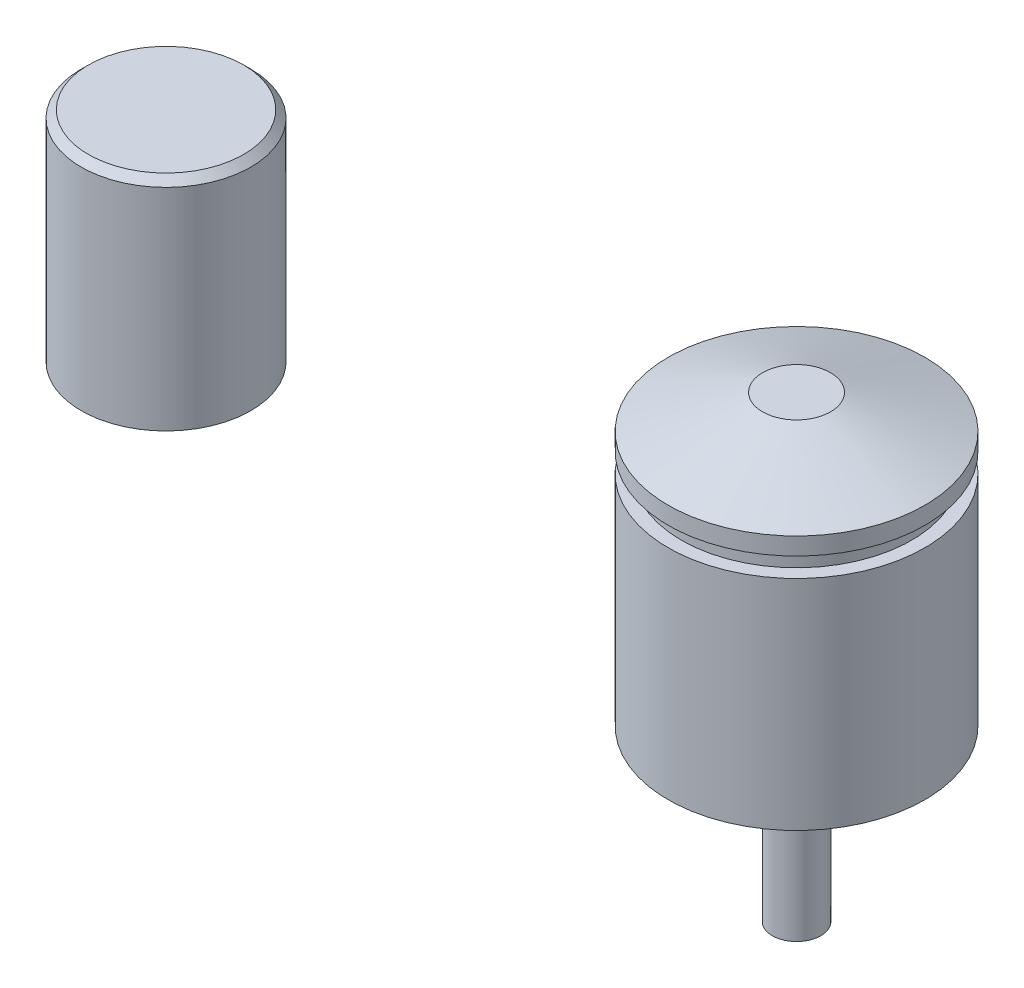
ISO-10303-21;
HEADER;
FILE_DESCRIPTION(('STEP AP214'),'2;1');
FILE_NAME('part.step','',(''),(''),'','','');
FILE_SCHEMA(('AUTOMOTIVE_DESIGN { 1 0 10303 214 1 1 1 1 }'));
ENDSEC;
DATA;
#1=APPLICATION_CONTEXT('core data for automotive mechanical design processes');
#2=APPLICATION_PROTOCOL_DEFINITION('international standard','automotive_design',2000,#1);
#3=PRODUCT_CONTEXT('',#1,'mechanical');
#4=PRODUCT('Part','Part','',(#3));
#5=PRODUCT_RELATED_PRODUCT_CATEGORY('part','',(#4));
#6=PRODUCT_DEFINITION_FORMATION('','',#4);
#7=PRODUCT_DEFINITION_CONTEXT('part definition',#1,'design');
#8=PRODUCT_DEFINITION('design','',#6,#7);
#9=PRODUCT_DEFINITION_SHAPE('','',#8);
#10=(LENGTH_UNIT() NAMED_UNIT(*) SI_UNIT(.MILLI.,.METRE.));
#11=(NAMED_UNIT(*) PLANE_ANGLE_UNIT() SI_UNIT($,.RADIAN.));
#12=(NAMED_UNIT(*) SI_UNIT($,.STERADIAN.) SOLID_ANGLE_UNIT());
#13=UNCERTAINTY_MEASURE_WITH_UNIT(LENGTH_MEASURE(1.E-05),#10,'distance_accuracy_value','');
#14=(GEOMETRIC_REPRESENTATION_CONTEXT(3) GLOBAL_UNCERTAINTY_ASSIGNED_CONTEXT((#13)) GLOBAL_UNIT_ASSIGNED_CONTEXT((#10,
#11,#12)) REPRESENTATION_CONTEXT('',''));
#15=CARTESIAN_POINT('',(0.,0.,0.));
#16=DIRECTION('',(0.,0.,1.));
#17=DIRECTION('',(1.,0.,0.));
#18=AXIS2_PLACEMENT_3D('',#15,#16,#17);
#19=CARTESIAN_POINT('',(13.,30.6,0.));
#20=DIRECTION('',(0.,1.,0.));
#21=DIRECTION('',(0.,0.,1.));
#22=AXIS2_PLACEMENT_3D('',#19,#20,#21);
#23=PLANE('',#22);
#24=CARTESIAN_POINT('',(13.,30.6,0.));
#25=DIRECTION('',(0.,-1.,0.));
#26=DIRECTION('',(0.,0.,-1.));
#27=AXIS2_PLACEMENT_3D('',#24,#25,#26);
#28=CIRCLE('',#27,0.499999999999999);
#29=CARTESIAN_POINT('',(13.,30.6,-0.499999999999999));
#30=VERTEX_POINT('',#29);
#31=EDGE_CURVE('E13',#30,#30,#28,.T.);
#32=ORIENTED_EDGE('',*,*,#31,.T.);
#33=EDGE_LOOP('',(#32));
#34=FACE_BOUND('',#33,.T.);
#35=ADVANCED_FACE('F56',(#34),#23,.F.);
#36=CARTESIAN_POINT('',(13.,34.1,0.));
#37=DIRECTION('',(0.,-1.,0.));
#38=DIRECTION('',(0.,0.,-1.));
#39=AXIS2_PLACEMENT_3D('',#36,#37,#38);
#40=CYLINDRICAL_SURFACE('',#39,0.499999999999999);
#41=ORIENTED_EDGE('',*,*,#31,.F.);
#42=EDGE_LOOP('',(#41));
#43=FACE_BOUND('',#42,.T.);
#44=CARTESIAN_POINT('',(13.,34.1,0.));
#45=DIRECTION('',(0.,-1.,0.));
#46=DIRECTION('',(0.,0.,-1.));
#47=AXIS2_PLACEMENT_3D('',#44,#45,#46);
#48=CIRCLE('',#47,0.499999999999999);
#49=CARTESIAN_POINT('',(13.,34.1,-0.499999999999999));
#50=VERTEX_POINT('',#49);
#51=EDGE_CURVE('E62',#50,#50,#48,.T.);
#52=ORIENTED_EDGE('',*,*,#51,.T.);
#53=EDGE_LOOP('',(#52));
#54=FACE_BOUND('',#53,.T.);
#55=ADVANCED_FACE('F103',(#43,#54),#40,.T.);
#56=CARTESIAN_POINT('',(12.5,34.1,0.));
#57=DIRECTION('',(0.,1.,0.));
#58=DIRECTION('',(0.,0.,1.));
#59=AXIS2_PLACEMENT_3D('',#56,#57,#58);
#60=PLANE('',#59);
#61=ORIENTED_EDGE('',*,*,#51,.F.);
#62=EDGE_LOOP('',(#61));
#63=FACE_BOUND('',#62,.T.);
#64=CARTESIAN_POINT('',(13.,34.1,0.));
#65=DIRECTION('',(0.,-1.,0.));
#66=DIRECTION('',(0.,0.,-1.));
#67=AXIS2_PLACEMENT_3D('',#64,#65,#66);
#68=CIRCLE('',#67,2.64559279724284);
#69=CARTESIAN_POINT('',(13.,34.1,-2.64559279724284));
#70=VERTEX_POINT('',#69);
#71=EDGE_CURVE('E66',#70,#70,#68,.T.);
#72=ORIENTED_EDGE('',*,*,#71,.T.);
#73=EDGE_LOOP('',(#72));
#74=FACE_BOUND('',#73,.T.);
#75=ADVANCED_FACE('F107',(#63,#74),#60,.F.);
#76=CARTESIAN_POINT('',(13.,34.1,0.));
#77=DIRECTION('',(0.,-1.,0.));
#78=DIRECTION('',(0.,0.,-1.));
#79=AXIS2_PLACEMENT_3D('',#76,#77,#78);
#80=CYLINDRICAL_SURFACE('',#79,2.64559279724284);
#81=ORIENTED_EDGE('',*,*,#71,.F.);
#82=EDGE_LOOP('',(#81));
#83=FACE_BOUND('',#82,.T.);
#84=CARTESIAN_POINT('',(13.,38.6,0.));
#85=DIRECTION('',(0.,-1.,0.));
#86=DIRECTION('',(0.,0.,-1.));
#87=AXIS2_PLACEMENT_3D('',#84,#85,#86);
#88=CIRCLE('',#87,2.64559279724284);
#89=CARTESIAN_POINT('',(13.,38.6,-2.64559279724284));
#90=VERTEX_POINT('',#89);
#91=EDGE_CURVE('E70',#90,#90,#88,.T.);
#92=ORIENTED_EDGE('',*,*,#91,.T.);
#93=EDGE_LOOP('',(#92));
#94=FACE_BOUND('',#93,.T.);
#95=ADVANCED_FACE('F112',(#83,#94),#80,.T.);
#96=CARTESIAN_POINT('',(10.3544072027572,38.6,0.));
#97=DIRECTION('',(0.,-1.,0.));
#98=DIRECTION('',(0.,0.,-1.));
#99=AXIS2_PLACEMENT_3D('',#96,#97,#98);
#100=PLANE('',#99);
#101=ORIENTED_EDGE('',*,*,#91,.F.);
#102=EDGE_LOOP('',(#101));
#103=FACE_BOUND('',#102,.T.);
#104=CARTESIAN_POINT('',(13.,38.6,0.));
#105=DIRECTION('',(0.,-1.,0.));
#106=DIRECTION('',(0.,0.,-1.));
#107=AXIS2_PLACEMENT_3D('',#104,#105,#106);
#108=CIRCLE('',#107,2.375);
#109=CARTESIAN_POINT('',(13.,38.6,-2.375));
#110=VERTEX_POINT('',#109);
#111=EDGE_CURVE('E75',#110,#110,#108,.T.);
#112=ORIENTED_EDGE('',*,*,#111,.T.);
#113=EDGE_LOOP('',(#112));
#114=FACE_BOUND('',#113,.T.);
#115=ADVANCED_FACE('F118',(#103,#114),#100,.F.);
#116=CARTESIAN_POINT('',(13.,34.1,0.));
#117=DIRECTION('',(0.,-1.,0.));
#118=DIRECTION('',(0.,0.,-1.));
#119=AXIS2_PLACEMENT_3D('',#116,#117,#118);
#120=CYLINDRICAL_SURFACE('',#119,2.375);
#121=ORIENTED_EDGE('',*,*,#111,.F.);
#122=EDGE_LOOP('',(#121));
#123=FACE_BOUND('',#122,.T.);
#124=CARTESIAN_POINT('',(13.,39.,0.));
#125=DIRECTION('',(0.,-1.,0.));
#126=DIRECTION('',(0.,0.,-1.));
#127=AXIS2_PLACEMENT_3D('',#124,#125,#126);
#128=CIRCLE('',#127,2.375);
#129=CARTESIAN_POINT('',(13.,39.,-2.375));
#130=VERTEX_POINT('',#129);
#131=EDGE_CURVE('E78',#130,#130,#128,.T.);
#132=ORIENTED_EDGE('',*,*,#131,.T.);
#133=EDGE_LOOP('',(#132));
#134=FACE_BOUND('',#133,.T.);
#135=ADVANCED_FACE('F122',(#123,#134),#120,.T.);
#136=CARTESIAN_POINT('',(10.625,39.,0.));
#137=DIRECTION('',(0.,1.,0.));
#138=DIRECTION('',(0.,0.,1.));
#139=AXIS2_PLACEMENT_3D('',#136,#137,#138);
#140=PLANE('',#139);
#141=ORIENTED_EDGE('',*,*,#131,.F.);
#142=EDGE_LOOP('',(#141));
#143=FACE_BOUND('',#142,.T.);
#144=CARTESIAN_POINT('',(13.,39.,0.));
#145=DIRECTION('',(0.,-1.,0.));
#146=DIRECTION('',(0.,0.,-1.));
#147=AXIS2_PLACEMENT_3D('',#144,#145,#146);
#148=CIRCLE('',#147,2.64559279724284);
#149=CARTESIAN_POINT('',(13.,39.,-2.64559279724284));
#150=VERTEX_POINT('',#149);
#151=EDGE_CURVE('E81',#150,#150,#148,.T.);
#152=ORIENTED_EDGE('',*,*,#151,.T.);
#153=EDGE_LOOP('',(#152));
#154=FACE_BOUND('',#153,.T.);
#155=ADVANCED_FACE('F126',(#143,#154),#140,.F.);
#156=CARTESIAN_POINT('',(13.,34.1,0.));
#157=DIRECTION('',(0.,-1.,0.));
#158=DIRECTION('',(0.,0.,-1.));
#159=AXIS2_PLACEMENT_3D('',#156,#157,#158);
#160=CYLINDRICAL_SURFACE('',#159,2.64559279724284);
#161=ORIENTED_EDGE('',*,*,#151,.F.);
#162=EDGE_LOOP('',(#161));
#163=FACE_BOUND('',#162,.T.);
#164=CARTESIAN_POINT('',(13.,39.3586912321662,0.));
#165=DIRECTION('',(0.,-1.,0.));
#166=DIRECTION('',(0.,0.,-1.));
#167=AXIS2_PLACEMENT_3D('',#164,#165,#166);
#168=CIRCLE('',#167,2.64559279724284);
#169=CARTESIAN_POINT('',(13.,39.3586912321662,-2.64559279724283));
#170=VERTEX_POINT('',#169);
#171=EDGE_CURVE('E84',#170,#170,#168,.T.);
#172=ORIENTED_EDGE('',*,*,#171,.T.);
#173=EDGE_LOOP('',(#172));
#174=FACE_BOUND('',#173,.T.);
#175=ADVANCED_FACE('F99',(#163,#174),#160,.T.);
#176=CARTESIAN_POINT('',(13.,40.0550943943815,0.));
#177=DIRECTION('',(0.,-1.,0.));
#178=DIRECTION('',(0.,0.,-1.));
#179=AXIS2_PLACEMENT_3D('',#176,#177,#178);
#180=CONICAL_SURFACE('',#179,0.699999999999999,1.22706665528975);
#181=CARTESIAN_POINT('',(13.,40.0550943943815,0.));
#182=DIRECTION('',(0.,-1.,0.));
#183=DIRECTION('',(0.,0.,-1.));
#184=AXIS2_PLACEMENT_3D('',#181,#182,#183);
#185=CIRCLE('',#184,0.699999999999999);
#186=CARTESIAN_POINT('',(13.,40.0550943943815,-0.69999999999999));
#187=VERTEX_POINT('',#186);
#188=EDGE_CURVE('E87',#187,#187,#185,.T.);
#189=CARTESIAN_POINT('',(13.,39.3586912321662,-2.64559279724283));
#190=CARTESIAN_POINT('',(13.,39.3659454317726,-2.62532620560488));
#191=CARTESIAN_POINT('',(13.,39.373199631379,-2.60505961396693));
#192=CARTESIAN_POINT('',(13.,39.3877080305918,-2.56452643069104));
#193=CARTESIAN_POINT('',(13.,39.3949622301983,-2.5442598390531));
#194=CARTESIAN_POINT('',(13.,39.4094706294111,-2.5037266557772));
#195=CARTESIAN_POINT('',(13.,39.4167248290175,-2.48346006413926));
#196=CARTESIAN_POINT('',(13.,39.4312332282303,-2.44292688086337));
#197=CARTESIAN_POINT('',(13.,39.4384874278367,-2.42266028922542));
#198=CARTESIAN_POINT('',(13.,39.4529958270495,-2.38212710594953));
#199=CARTESIAN_POINT('',(13.,39.4602500266559,-2.36186051431158));
#200=CARTESIAN_POINT('',(13.,39.4747584258688,-2.32132733103569));
#201=CARTESIAN_POINT('',(13.,39.4820126254752,-2.30106073939774));
#202=CARTESIAN_POINT('',(13.,39.496521024688,-2.26052755612185));
#203=CARTESIAN_POINT('',(13.,39.5037752242944,-2.2402609644839));
#204=CARTESIAN_POINT('',(13.,39.5182836235072,-2.19972778120801));
#205=CARTESIAN_POINT('',(13.,39.5255378231136,-2.17946118957006));
#206=CARTESIAN_POINT('',(13.,39.5400462223264,-2.13892800629417));
#207=CARTESIAN_POINT('',(13.,39.5473004219329,-2.11866141465623));
#208=CARTESIAN_POINT('',(13.,39.5618088211457,-2.07812823138033));
#209=CARTESIAN_POINT('',(13.,39.5690630207521,-2.05786163974239));
#210=CARTESIAN_POINT('',(13.,39.5835714199649,-2.01732845646649));
#211=CARTESIAN_POINT('',(13.,39.5908256195713,-1.99706186482855));
#212=CARTESIAN_POINT('',(13.,39.6053340187841,-1.95652868155266));
#213=CARTESIAN_POINT('',(13.,39.6125882183905,-1.93626208991471));
#214=CARTESIAN_POINT('',(13.,39.6270966176033,-1.89572890663882));
#215=CARTESIAN_POINT('',(13.,39.6343508172098,-1.87546231500087));
#216=CARTESIAN_POINT('',(13.,39.6488592164226,-1.83492913172498));
#217=CARTESIAN_POINT('',(13.,39.656113416029,-1.81466254008703));
#218=CARTESIAN_POINT('',(13.,39.6706218152418,-1.77412935681114));
#219=CARTESIAN_POINT('',(13.,39.6778760148482,-1.75386276517319));
#220=CARTESIAN_POINT('',(13.,39.692384414061,-1.7133295818973));
#221=CARTESIAN_POINT('',(13.,39.6996386136674,-1.69306299025936));
#222=CARTESIAN_POINT('',(13.,39.7141470128803,-1.65252980698346));
#223=CARTESIAN_POINT('',(13.,39.7214012124867,-1.63226321534552));
#224=CARTESIAN_POINT('',(13.,39.7359096116995,-1.59173003206962));
#225=CARTESIAN_POINT('',(13.,39.7431638113059,-1.57146344043168));
#226=CARTESIAN_POINT('',(13.,39.7576722105187,-1.53093025715579));
#227=CARTESIAN_POINT('',(13.,39.7649264101251,-1.51066366551784));
#228=CARTESIAN_POINT('',(13.,39.7794348093379,-1.47013048224195));
#229=CARTESIAN_POINT('',(13.,39.7866890089443,-1.449863890604));
#230=CARTESIAN_POINT('',(13.,39.8011974081572,-1.40933070732811));
#231=CARTESIAN_POINT('',(13.,39.8084516077636,-1.38906411569016));
#232=CARTESIAN_POINT('',(13.,39.8229600069764,-1.34853093241427));
#233=CARTESIAN_POINT('',(13.,39.8302142065828,-1.32826434077632));
#234=CARTESIAN_POINT('',(13.,39.8447226057956,-1.28773115750043));
#235=CARTESIAN_POINT('',(13.,39.851976805402,-1.26746456586248));
#236=CARTESIAN_POINT('',(13.,39.8664852046148,-1.22693138258659));
#237=CARTESIAN_POINT('',(13.,39.8737394042212,-1.20666479094865));
#238=CARTESIAN_POINT('',(13.,39.8882478034341,-1.16613160767275));
#239=CARTESIAN_POINT('',(13.,39.8955020030405,-1.14586501603481));
#240=CARTESIAN_POINT('',(13.,39.9100104022533,-1.10533183275891));
#241=CARTESIAN_POINT('',(13.,39.9172646018597,-1.08506524112097));
#242=CARTESIAN_POINT('',(13.,39.9317730010725,-1.04453205784508));
#243=CARTESIAN_POINT('',(13.,39.9390272006789,-1.02426546620713));
#244=CARTESIAN_POINT('',(13.,39.9535355998917,-0.983732282931237));
#245=CARTESIAN_POINT('',(13.,39.9607897994981,-0.96346569129329));
#246=CARTESIAN_POINT('',(13.,39.975298198711,-0.922932508017398));
#247=CARTESIAN_POINT('',(13.,39.9825523983174,-0.902665916379452));
#248=CARTESIAN_POINT('',(13.,39.9970607975302,-0.86213273310356));
#249=CARTESIAN_POINT('',(13.,40.0043149971366,-0.841866141465613));
#250=CARTESIAN_POINT('',(13.,40.0188233963494,-0.801332958189721));
#251=CARTESIAN_POINT('',(13.,40.0260775959558,-0.781066366551774));
#252=CARTESIAN_POINT('',(13.,40.0405859951686,-0.740533183275882));
#253=CARTESIAN_POINT('',(13.,40.0478401947751,-0.720266591637935));
#254=CARTESIAN_POINT('',(13.,40.0550943943815,-0.69999999999999));
#255=B_SPLINE_CURVE_WITH_KNOTS('',3,(#189,#190,#191,#192,#193,#194,#195,#196,#197,#198,#199,
#200,#201,#202,#203,#204,#205,#206,#207,#208,#209,#210,#211,#212,#213,#214,#215,#216,#217,#218,
#219,#220,#221,#222,#223,#224,#225,#226,#227,#228,#229,#230,#231,#232,#233,#234,#235,#236,#237,
#238,#239,#240,#241,#242,#243,#244,#245,#246,#247,#248,#249,#250,#251,#252,#253,#254),
.UNSPECIFIED.,.F.,.F.,(4,2,2,2,2,2,2,2,2,2,2,2,2,2,2,2,2,2,2,2,2,2,2,2,2,2,2,2,2,2,2,2,4),(0.,
0.0645772664096277,0.129154532819255,0.193731799228882,0.25830906563851,0.322886332048139,
0.387463598457766,0.452040864867394,0.516618131277023,0.581195397686651,0.645772664096278,
0.710349930505905,0.774927196915533,0.839504463325162,0.90408172973479,0.968658996144417,
1.03323626255405,1.09781352896367,1.1623907953733,1.22696806178293,1.29154532819256,
1.35612259460219,1.42069986101181,1.48527712742144,1.54985439383107,1.6144316602407,
1.67900892665032,1.74358619305995,1.80816345946958,1.87274072587921,1.93731799228884,
2.00189525869846,2.06647252510809),.UNSPECIFIED.);
#256=EDGE_CURVE('BSEAM91',#170,#187,#255,.T.);
#257=ORIENTED_EDGE('',*,*,#171,.F.);
#258=ORIENTED_EDGE('',*,*,#188,.T.);
#259=ORIENTED_EDGE('',*,*,#256,.T.);
#260=ORIENTED_EDGE('',*,*,#256,.F.);
#261=EDGE_LOOP('',(#257,#259,#258,#260));
#262=FACE_BOUND('',#261,.T.);
#263=ADVANCED_FACE('F91',(#262),#180,.T.);
#264=CARTESIAN_POINT('',(12.3,40.0550943943815,0.));
#265=DIRECTION('',(0.,-1.,0.));
#266=DIRECTION('',(0.,0.,-1.));
#267=AXIS2_PLACEMENT_3D('',#264,#265,#266);
#268=PLANE('',#267);
#269=ORIENTED_EDGE('',*,*,#188,.F.);
#270=EDGE_LOOP('',(#269));
#271=FACE_BOUND('',#270,.T.);
#272=ADVANCED_FACE('F93',(#271),#268,.F.);
#273=CLOSED_SHELL('',(#35,#55,#75,#95,#115,#135,#155,#175,#263,#272));
#274=MANIFOLD_SOLID_BREP('B2',#273);
#275=CARTESIAN_POINT('',(0.,37.3338765655707,0.));
#276=DIRECTION('',(0.,1.,0.));
#277=DIRECTION('',(0.,0.,1.));
#278=AXIS2_PLACEMENT_3D('',#275,#276,#277);
#279=PLANE('',#278);
#280=CARTESIAN_POINT('',(0.,37.3338765655707,0.));
#281=DIRECTION('',(0.,-1.,0.));
#282=DIRECTION('',(0.,0.,-1.));
#283=AXIS2_PLACEMENT_3D('',#280,#281,#282);
#284=CIRCLE('',#283,0.78167854951987);
#285=CARTESIAN_POINT('',(0.,37.3338765655707,-0.78167854951987));
#286=VERTEX_POINT('',#285);
#287=EDGE_CURVE('E218',#286,#286,#284,.T.);
#288=ORIENTED_EDGE('',*,*,#287,.T.);
#289=EDGE_LOOP('',(#288));
#290=FACE_BOUND('',#289,.T.);
#291=ADVANCED_FACE('F207',(#290),#279,.F.);
#292=CARTESIAN_POINT('',(0.,38.6,0.));
#293=DIRECTION('',(0.,-1.,0.));
#294=DIRECTION('',(0.,0.,-1.));
#295=AXIS2_PLACEMENT_3D('',#292,#293,#294);
#296=CYLINDRICAL_SURFACE('',#295,0.781678549519869);
#297=ORIENTED_EDGE('',*,*,#287,.F.);
#298=EDGE_LOOP('',(#297));
#299=FACE_BOUND('',#298,.T.);
#300=CARTESIAN_POINT('',(0.,34.1,0.));
#301=DIRECTION('',(0.,-1.,0.));
#302=DIRECTION('',(0.,0.,-1.));
#303=AXIS2_PLACEMENT_3D('',#300,#301,#302);
#304=CIRCLE('',#303,0.781678549519868);
#305=CARTESIAN_POINT('',(0.,34.1,-0.781678549519868));
#306=VERTEX_POINT('',#305);
#307=EDGE_CURVE('E222',#306,#306,#304,.T.);
#308=ORIENTED_EDGE('',*,*,#307,.T.);
#309=EDGE_LOOP('',(#308));
#310=FACE_BOUND('',#309,.T.);
#311=ADVANCED_FACE('F242',(#299,#310),#296,.F.);
#312=CARTESIAN_POINT('',(-0.781678549519868,34.1,0.));
#313=DIRECTION('',(0.,1.,0.));
#314=DIRECTION('',(0.,0.,1.));
#315=AXIS2_PLACEMENT_3D('',#312,#313,#314);
#316=PLANE('',#315);
#317=ORIENTED_EDGE('',*,*,#307,.F.);
#318=EDGE_LOOP('',(#317));
#319=FACE_BOUND('',#318,.T.);
#320=CARTESIAN_POINT('',(0.,34.1,0.));
#321=DIRECTION('',(0.,-1.,0.));
#322=DIRECTION('',(0.,0.,-1.));
#323=AXIS2_PLACEMENT_3D('',#320,#321,#322);
#324=CIRCLE('',#323,1.75);
#325=CARTESIAN_POINT('',(0.,34.1,-1.75));
#326=VERTEX_POINT('',#325);
#327=EDGE_CURVE('E227',#326,#326,#324,.T.);
#328=ORIENTED_EDGE('',*,*,#327,.T.);
#329=EDGE_LOOP('',(#328));
#330=FACE_BOUND('',#329,.T.);
#331=ADVANCED_FACE('F231',(#319,#330),#316,.F.);
#332=CARTESIAN_POINT('',(0.,38.6,0.));
#333=DIRECTION('',(0.,-1.,0.));
#334=DIRECTION('',(0.,0.,-1.));
#335=AXIS2_PLACEMENT_3D('',#332,#333,#334);
#336=CYLINDRICAL_SURFACE('',#335,1.75);
#337=CARTESIAN_POINT('',(0.,38.45,0.));
#338=DIRECTION('',(0.,-1.,0.));
#339=DIRECTION('',(0.,0.,-1.));
#340=AXIS2_PLACEMENT_3D('',#337,#338,#339);
#341=CIRCLE('',#340,1.75);
#342=CARTESIAN_POINT('',(0.,38.45,-1.75));
#343=VERTEX_POINT('',#342);
#344=EDGE_CURVE('E214',#343,#343,#341,.T.);
#345=ORIENTED_EDGE('',*,*,#344,.T.);
#346=EDGE_LOOP('',(#345));
#347=FACE_BOUND('',#346,.T.);
#348=ORIENTED_EDGE('',*,*,#327,.F.);
#349=EDGE_LOOP('',(#348));
#350=FACE_BOUND('',#349,.T.);
#351=ADVANCED_FACE('F233',(#347,#350),#336,.T.);
#352=CARTESIAN_POINT('',(-1.75,38.6,0.));
#353=DIRECTION('',(0.,-1.,0.));
#354=DIRECTION('',(0.,0.,-1.));
#355=AXIS2_PLACEMENT_3D('',#352,#353,#354);
#356=PLANE('',#355);
#357=CARTESIAN_POINT('',(0.,38.6,0.));
#358=DIRECTION('',(0.,-1.,0.));
#359=DIRECTION('',(0.,0.,-1.));
#360=AXIS2_PLACEMENT_3D('',#357,#358,#359);
#361=CIRCLE('',#360,1.6);
#362=CARTESIAN_POINT('',(0.,38.6,-1.6));
#363=VERTEX_POINT('',#362);
#364=EDGE_CURVE('E55',#363,#363,#361,.F.);
#365=ORIENTED_EDGE('',*,*,#364,.T.);
#366=EDGE_LOOP('',(#365));
#367=FACE_BOUND('',#366,.T.);
#368=ADVANCED_FACE('F235',(#367),#356,.F.);
#369=CARTESIAN_POINT('',(0.,38.45,0.));
#370=DIRECTION('',(0.,-1.,0.));
#371=DIRECTION('',(0.,0.,-1.));
#372=AXIS2_PLACEMENT_3D('',#369,#370,#371);
#373=CONICAL_SURFACE('',#372,1.75,0.785398163397464);
#374=ORIENTED_EDGE('',*,*,#364,.F.);
#375=EDGE_LOOP('',(#374));
#376=FACE_BOUND('',#375,.T.);
#377=ORIENTED_EDGE('',*,*,#344,.F.);
#378=EDGE_LOOP('',(#377));
#379=FACE_BOUND('',#378,.T.);
#380=ADVANCED_FACE('F209',(#376,#379),#373,.T.);
#381=CLOSED_SHELL('',(#291,#311,#331,#351,#368,#380));
#382=MANIFOLD_SOLID_BREP('B8',#381);
#383=ADVANCED_BREP_SHAPE_REPRESENTATION('',(#18,#274,#382),#14);
#384=SHAPE_DEFINITION_REPRESENTATION(#9,#383);
ENDSEC;
END-ISO-10303-21;
